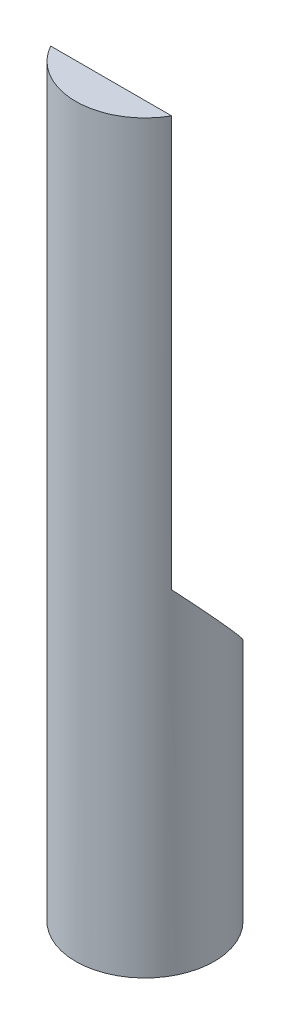
ISO-10303-21;
HEADER;
FILE_DESCRIPTION(('STEP AP214'),'2;1');
FILE_NAME('part.step','',(''),(''),'','','');
FILE_SCHEMA(('AUTOMOTIVE_DESIGN { 1 0 10303 214 1 1 1 1 }'));
ENDSEC;
DATA;
#1=APPLICATION_CONTEXT('core data for automotive mechanical design processes');
#2=APPLICATION_PROTOCOL_DEFINITION('international standard','automotive_design',2000,#1);
#3=PRODUCT_CONTEXT('',#1,'mechanical');
#4=PRODUCT('Part','Part','',(#3));
#5=PRODUCT_RELATED_PRODUCT_CATEGORY('part','',(#4));
#6=PRODUCT_DEFINITION_FORMATION('','',#4);
#7=PRODUCT_DEFINITION_CONTEXT('part definition',#1,'design');
#8=PRODUCT_DEFINITION('design','',#6,#7);
#9=PRODUCT_DEFINITION_SHAPE('','',#8);
#10=(LENGTH_UNIT() NAMED_UNIT(*) SI_UNIT(.MILLI.,.METRE.));
#11=(NAMED_UNIT(*) PLANE_ANGLE_UNIT() SI_UNIT($,.RADIAN.));
#12=(NAMED_UNIT(*) SI_UNIT($,.STERADIAN.) SOLID_ANGLE_UNIT());
#13=UNCERTAINTY_MEASURE_WITH_UNIT(LENGTH_MEASURE(1.E-05),#10,'distance_accuracy_value','');
#14=(GEOMETRIC_REPRESENTATION_CONTEXT(3) GLOBAL_UNCERTAINTY_ASSIGNED_CONTEXT((#13)) GLOBAL_UNIT_ASSIGNED_CONTEXT((#10,
#11,#12)) REPRESENTATION_CONTEXT('',''));
#15=CARTESIAN_POINT('',(0.,0.,0.));
#16=DIRECTION('',(0.,0.,1.));
#17=DIRECTION('',(1.,0.,0.));
#18=AXIS2_PLACEMENT_3D('',#15,#16,#17);
#19=CARTESIAN_POINT('',(0.,42.672,0.));
#20=DIRECTION('',(0.,-1.,0.));
#21=DIRECTION('',(0.,0.,-1.));
#22=AXIS2_PLACEMENT_3D('',#19,#20,#21);
#23=CYLINDRICAL_SURFACE('',#22,3.97129);
#24=DIRECTION('',(0.,-1.,0.));
#25=VECTOR('',#24,1.);
#26=CARTESIAN_POINT('',(-3.4655877654447,42.672,1.93929));
#27=LINE('',#26,#25);
#28=CARTESIAN_POINT('',(-3.4655877654447,42.672,1.93929));
#29=VERTEX_POINT('',#28);
#30=CARTESIAN_POINT('',(-3.4655877654447,19.1605938281405,1.93929));
#31=VERTEX_POINT('',#30);
#32=EDGE_CURVE('E45',#29,#31,#27,.T.);
#33=ORIENTED_EDGE('',*,*,#32,.T.);
#34=CARTESIAN_POINT('',(0.,17.0408416202396,0.));
#35=DIRECTION('',(0.,-0.675002517176411,0.737815425296537));
#36=DIRECTION('',(0.,-0.737815425296537,-0.675002517176411));
#37=AXIS2_PLACEMENT_3D('',#34,#35,#36);
#38=ELLIPSE('',#37,5.88337065261952,3.97129);
#39=CARTESIAN_POINT('',(3.4655877654447,19.1605938281405,1.93929));
#40=VERTEX_POINT('',#39);
#41=EDGE_CURVE('E11',#31,#40,#38,.T.);
#42=ORIENTED_EDGE('',*,*,#41,.T.);
#43=DIRECTION('',(0.,-1.,0.));
#44=VECTOR('',#43,1.);
#45=CARTESIAN_POINT('',(3.4655877654447,42.672,1.93929));
#46=LINE('',#45,#44);
#47=CARTESIAN_POINT('',(3.4655877654447,42.672,1.93929));
#48=VERTEX_POINT('',#47);
#49=EDGE_CURVE('E60',#40,#48,#46,.F.);
#50=ORIENTED_EDGE('',*,*,#49,.T.);
#51=CARTESIAN_POINT('',(0.,42.672,0.));
#52=DIRECTION('',(0.,1.,0.));
#53=DIRECTION('',(0.,0.,1.));
#54=AXIS2_PLACEMENT_3D('',#51,#52,#53);
#55=CIRCLE('',#54,3.97129);
#56=EDGE_CURVE('E65',#29,#48,#55,.T.);
#57=ORIENTED_EDGE('',*,*,#56,.F.);
#58=EDGE_LOOP('',(#33,#42,#50,#57));
#59=FACE_BOUND('',#58,.T.);
#60=CARTESIAN_POINT('',(0.,0.,0.));
#61=DIRECTION('',(0.,1.,0.));
#62=DIRECTION('',(0.,0.,1.));
#63=AXIS2_PLACEMENT_3D('',#60,#61,#62);
#64=CIRCLE('',#63,3.97129);
#65=CARTESIAN_POINT('',(0.,0.,3.97129));
#66=VERTEX_POINT('',#65);
#67=EDGE_CURVE('E66',#66,#66,#64,.T.);
#68=ORIENTED_EDGE('',*,*,#67,.T.);
#69=EDGE_LOOP('',(#68));
#70=FACE_BOUND('',#69,.T.);
#71=ADVANCED_FACE('F31',(#59,#70),#23,.T.);
#72=CARTESIAN_POINT('',(0.,42.672,0.));
#73=DIRECTION('',(0.,1.,0.));
#74=DIRECTION('',(0.,0.,1.));
#75=AXIS2_PLACEMENT_3D('',#72,#73,#74);
#76=PLANE('',#75);
#77=DIRECTION('',(1.,0.,0.));
#78=VECTOR('',#77,1.);
#79=CARTESIAN_POINT('',(0.,42.672,1.93929));
#80=LINE('',#79,#78);
#81=EDGE_CURVE('E38',#29,#48,#80,.T.);
#82=ORIENTED_EDGE('',*,*,#81,.F.);
#83=ORIENTED_EDGE('',*,*,#56,.T.);
#84=EDGE_LOOP('',(#82,#83));
#85=FACE_BOUND('',#84,.T.);
#86=ADVANCED_FACE('F73',(#85),#76,.T.);
#87=CARTESIAN_POINT('',(0.,0.,0.));
#88=DIRECTION('',(0.,1.,0.));
#89=DIRECTION('',(0.,0.,1.));
#90=AXIS2_PLACEMENT_3D('',#87,#88,#89);
#91=PLANE('',#90);
#92=ORIENTED_EDGE('',*,*,#67,.F.);
#93=EDGE_LOOP('',(#92));
#94=FACE_BOUND('',#93,.T.);
#95=ADVANCED_FACE('F75',(#94),#91,.F.);
#96=CARTESIAN_POINT('',(-3.97129,19.1605938281405,1.93929));
#97=DIRECTION('',(0.,-0.675002517176411,0.737815425296537));
#98=DIRECTION('',(0.,-0.737815425296537,-0.675002517176411));
#99=AXIS2_PLACEMENT_3D('',#96,#97,#98);
#100=PLANE('',#99);
#101=ORIENTED_EDGE('',*,*,#41,.F.);
#102=DIRECTION('',(1.,0.,0.));
#103=VECTOR('',#102,1.);
#104=CARTESIAN_POINT('',(-3.97129,19.1605938281405,1.93929));
#105=LINE('',#104,#103);
#106=EDGE_CURVE('E57',#31,#40,#105,.T.);
#107=ORIENTED_EDGE('',*,*,#106,.T.);
#108=EDGE_LOOP('',(#101,#107));
#109=FACE_BOUND('',#108,.T.);
#110=ADVANCED_FACE('F56',(#109),#100,.F.);
#111=CARTESIAN_POINT('',(-3.97129,47.4841266560787,1.93929));
#112=DIRECTION('',(0.,0.,1.));
#113=DIRECTION('',(0.,-1.,0.));
#114=AXIS2_PLACEMENT_3D('',#111,#112,#113);
#115=PLANE('',#114);
#116=ORIENTED_EDGE('',*,*,#81,.T.);
#117=ORIENTED_EDGE('',*,*,#49,.F.);
#118=ORIENTED_EDGE('',*,*,#106,.F.);
#119=ORIENTED_EDGE('',*,*,#32,.F.);
#120=EDGE_LOOP('',(#116,#117,#118,#119));
#121=FACE_BOUND('',#120,.T.);
#122=ADVANCED_FACE('F59',(#121),#115,.F.);
#123=CLOSED_SHELL('',(#71,#86,#95,#110,#122));
#124=MANIFOLD_SOLID_BREP('B2',#123);
#125=ADVANCED_BREP_SHAPE_REPRESENTATION('',(#18,#124),#14);
#126=SHAPE_DEFINITION_REPRESENTATION(#9,#125);
ENDSEC;
END-ISO-10303-21;
